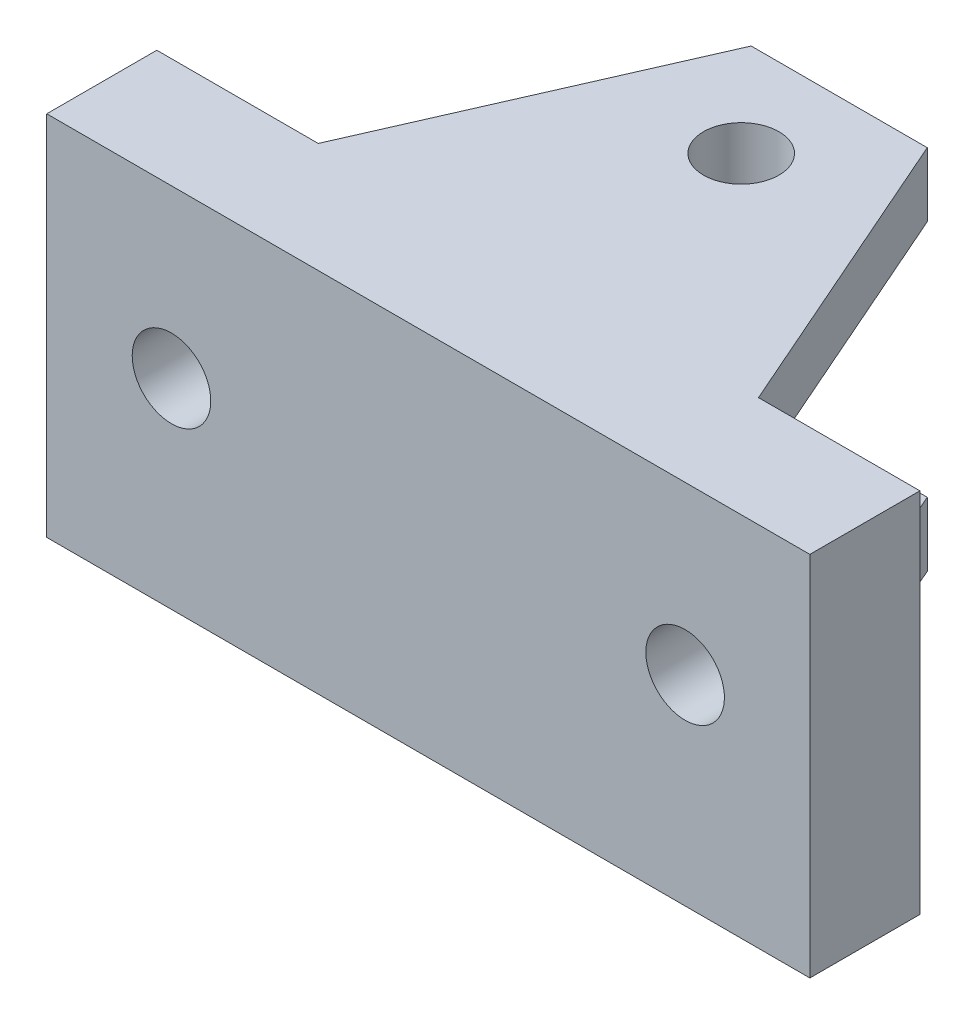
ISO-10303-21;
HEADER;
FILE_DESCRIPTION(('STEP AP214'),'2;1');
FILE_NAME('part.step','',(''),(''),'','','');
FILE_SCHEMA(('AUTOMOTIVE_DESIGN { 1 0 10303 214 1 1 1 1 }'));
ENDSEC;
DATA;
#1=APPLICATION_CONTEXT('core data for automotive mechanical design processes');
#2=APPLICATION_PROTOCOL_DEFINITION('international standard','automotive_design',2000,#1);
#3=PRODUCT_CONTEXT('',#1,'mechanical');
#4=PRODUCT('Part','Part','',(#3));
#5=PRODUCT_RELATED_PRODUCT_CATEGORY('part','',(#4));
#6=PRODUCT_DEFINITION_FORMATION('','',#4);
#7=PRODUCT_DEFINITION_CONTEXT('part definition',#1,'design');
#8=PRODUCT_DEFINITION('design','',#6,#7);
#9=PRODUCT_DEFINITION_SHAPE('','',#8);
#10=(LENGTH_UNIT() NAMED_UNIT(*) SI_UNIT(.MILLI.,.METRE.));
#11=(NAMED_UNIT(*) PLANE_ANGLE_UNIT() SI_UNIT($,.RADIAN.));
#12=(NAMED_UNIT(*) SI_UNIT($,.STERADIAN.) SOLID_ANGLE_UNIT());
#13=UNCERTAINTY_MEASURE_WITH_UNIT(LENGTH_MEASURE(1.E-05),#10,'distance_accuracy_value','');
#14=(GEOMETRIC_REPRESENTATION_CONTEXT(3) GLOBAL_UNCERTAINTY_ASSIGNED_CONTEXT((#13)) GLOBAL_UNIT_ASSIGNED_CONTEXT((#10,
#11,#12)) REPRESENTATION_CONTEXT('',''));
#15=CARTESIAN_POINT('',(0.,0.,0.));
#16=DIRECTION('',(0.,0.,1.));
#17=DIRECTION('',(1.,0.,0.));
#18=AXIS2_PLACEMENT_3D('',#15,#16,#17);
#19=CARTESIAN_POINT('',(76.2,8.7126108541866,-39.7797136586685));
#20=DIRECTION('',(0.,1.,0.));
#21=DIRECTION('',(0.,0.,1.));
#22=AXIS2_PLACEMENT_3D('',#19,#20,#21);
#23=PLANE('',#22);
#24=DIRECTION('',(-1.,0.,0.));
#25=VECTOR('',#24,1.);
#26=CARTESIAN_POINT('',(76.2,8.71261085418657,0.));
#27=LINE('',#26,#25);
#28=CARTESIAN_POINT('',(71.12,8.71261085418657,0.));
#29=VERTEX_POINT('',#28);
#30=CARTESIAN_POINT('',(5.08000000000003,8.71261085418657,0.));
#31=VERTEX_POINT('',#30);
#32=EDGE_CURVE('E244',#29,#31,#27,.T.);
#33=ORIENTED_EDGE('',*,*,#32,.T.);
#34=DIRECTION('',(0.,0.,-1.));
#35=VECTOR('',#34,1.);
#36=CARTESIAN_POINT('',(5.08,8.71261085418656,32.1538318089773));
#37=LINE('',#36,#35);
#38=CARTESIAN_POINT('',(5.08,8.71261085418658,-9.52499999999999));
#39=VERTEX_POINT('',#38);
#40=EDGE_CURVE('E70',#31,#39,#37,.T.);
#41=ORIENTED_EDGE('',*,*,#40,.T.);
#42=DIRECTION('',(-1.,0.,0.));
#43=VECTOR('',#42,1.);
#44=CARTESIAN_POINT('',(0.,8.71261085418656,-9.52499999999998));
#45=LINE('',#44,#43);
#46=CARTESIAN_POINT('',(19.05,8.71261085418656,-9.52499999999998));
#47=VERTEX_POINT('',#46);
#48=EDGE_CURVE('E153',#47,#39,#45,.T.);
#49=ORIENTED_EDGE('',*,*,#48,.F.);
#50=DIRECTION('',(-0.401990062035198,0.,0.915644030191284));
#51=VECTOR('',#50,1.);
#52=CARTESIAN_POINT('',(30.48,8.71261085418659,-35.5599999999999));
#53=LINE('',#52,#51);
#54=CARTESIAN_POINT('',(30.48,8.71261085418659,-35.56));
#55=VERTEX_POINT('',#54);
#56=EDGE_CURVE('E185',#55,#47,#53,.T.);
#57=ORIENTED_EDGE('',*,*,#56,.F.);
#58=DIRECTION('',(-1.,0.,0.));
#59=VECTOR('',#58,1.);
#60=CARTESIAN_POINT('',(30.48,8.71261085418659,-35.56));
#61=LINE('',#60,#59);
#62=CARTESIAN_POINT('',(45.72,8.71261085418659,-35.56));
#63=VERTEX_POINT('',#62);
#64=EDGE_CURVE('E182',#63,#55,#61,.T.);
#65=ORIENTED_EDGE('',*,*,#64,.F.);
#66=DIRECTION('',(-0.401990062035198,0.,-0.915644030191284));
#67=VECTOR('',#66,1.);
#68=CARTESIAN_POINT('',(45.72,8.71261085418659,-35.5599999999999));
#69=LINE('',#68,#67);
#70=CARTESIAN_POINT('',(57.15,8.71261085418658,-9.52499999999998));
#71=VERTEX_POINT('',#70);
#72=EDGE_CURVE('E186',#71,#63,#69,.T.);
#73=ORIENTED_EDGE('',*,*,#72,.F.);
#74=DIRECTION('',(-1.,0.,0.));
#75=VECTOR('',#74,1.);
#76=CARTESIAN_POINT('',(76.2,8.71261085418656,-9.52499999999998));
#77=LINE('',#76,#75);
#78=CARTESIAN_POINT('',(71.12,8.71261085418657,-9.52499999999999));
#79=VERTEX_POINT('',#78);
#80=EDGE_CURVE('E191',#79,#71,#77,.T.);
#81=ORIENTED_EDGE('',*,*,#80,.F.);
#82=DIRECTION('',(0.,0.,-1.));
#83=VECTOR('',#82,1.);
#84=CARTESIAN_POINT('',(71.12,8.71261085418656,32.1538318089773));
#85=LINE('',#84,#83);
#86=EDGE_CURVE('E287',#29,#79,#85,.T.);
#87=ORIENTED_EDGE('',*,*,#86,.F.);
#88=EDGE_LOOP('',(#33,#41,#49,#57,#65,#73,#81,#87));
#89=FACE_BOUND('',#88,.T.);
#90=CARTESIAN_POINT('',(38.1,8.71261085418658,-27.0797136586685));
#91=DIRECTION('',(0.,1.,0.));
#92=DIRECTION('',(0.,0.,1.));
#93=AXIS2_PLACEMENT_3D('',#90,#91,#92);
#94=CIRCLE('',#93,3.2639);
#95=CARTESIAN_POINT('',(38.1,8.71261085418656,-23.8158136586685));
#96=VERTEX_POINT('',#95);
#97=EDGE_CURVE('E198',#96,#96,#94,.F.);
#98=ORIENTED_EDGE('',*,*,#97,.F.);
#99=EDGE_LOOP('',(#98));
#100=FACE_BOUND('',#99,.T.);
#101=ADVANCED_FACE('F47',(#89,#100),#23,.F.);
#102=CARTESIAN_POINT('',(76.2,14.2625108541866,-9.52499999999999));
#103=DIRECTION('',(0.,-1.,0.));
#104=DIRECTION('',(0.,0.,-1.));
#105=AXIS2_PLACEMENT_3D('',#102,#103,#104);
#106=PLANE('',#105);
#107=CARTESIAN_POINT('',(38.1,14.2625108541866,-27.0797136586685));
#108=DIRECTION('',(0.,-1.,0.));
#109=DIRECTION('',(0.,0.,-1.));
#110=AXIS2_PLACEMENT_3D('',#107,#108,#109);
#111=CIRCLE('',#110,3.2639);
#112=CARTESIAN_POINT('',(38.1,14.2625108541866,-23.8158136586685));
#113=VERTEX_POINT('',#112);
#114=EDGE_CURVE('E222',#113,#113,#111,.T.);
#115=ORIENTED_EDGE('',*,*,#114,.T.);
#116=EDGE_LOOP('',(#115));
#117=FACE_BOUND('',#116,.T.);
#118=DIRECTION('',(-1.,0.,0.));
#119=VECTOR('',#118,1.);
#120=CARTESIAN_POINT('',(76.2,14.2625108541866,-35.56));
#121=LINE('',#120,#119);
#122=CARTESIAN_POINT('',(45.72,14.2625108541866,-35.56));
#123=VERTEX_POINT('',#122);
#124=CARTESIAN_POINT('',(30.48,14.2625108541866,-35.56));
#125=VERTEX_POINT('',#124);
#126=EDGE_CURVE('E230',#123,#125,#121,.T.);
#127=ORIENTED_EDGE('',*,*,#126,.T.);
#128=DIRECTION('',(-0.401990062035198,0.,0.915644030191284));
#129=VECTOR('',#128,1.);
#130=CARTESIAN_POINT('',(28.2852119700748,14.2625108541866,-30.5607605985037));
#131=LINE('',#130,#129);
#132=CARTESIAN_POINT('',(19.05,14.2625108541866,-9.52499999999998));
#133=VERTEX_POINT('',#132);
#134=EDGE_CURVE('E214',#125,#133,#131,.T.);
#135=ORIENTED_EDGE('',*,*,#134,.T.);
#136=DIRECTION('',(-1.,0.,0.));
#137=VECTOR('',#136,1.);
#138=CARTESIAN_POINT('',(76.2,14.2625108541866,-9.52499999999999));
#139=LINE('',#138,#137);
#140=CARTESIAN_POINT('',(57.15,14.2625108541866,-9.52499999999998));
#141=VERTEX_POINT('',#140);
#142=EDGE_CURVE('E11',#141,#133,#139,.T.);
#143=ORIENTED_EDGE('',*,*,#142,.F.);
#144=DIRECTION('',(-0.401990062035198,0.,-0.915644030191284));
#145=VECTOR('',#144,1.);
#146=CARTESIAN_POINT('',(60.2284039900249,14.2625108541866,-2.51307980049874));
#147=LINE('',#146,#145);
#148=EDGE_CURVE('E206',#141,#123,#147,.T.);
#149=ORIENTED_EDGE('',*,*,#148,.T.);
#150=EDGE_LOOP('',(#127,#135,#143,#149));
#151=FACE_BOUND('',#150,.T.);
#152=ADVANCED_FACE('F325',(#117,#151),#106,.F.);
#153=CARTESIAN_POINT('',(76.2,34.9127108541866,-9.52499999999998));
#154=DIRECTION('',(0.,0.,1.));
#155=DIRECTION('',(0.,-1.,0.));
#156=AXIS2_PLACEMENT_3D('',#153,#154,#155);
#157=PLANE('',#156);
#158=CARTESIAN_POINT('',(15.875,26.0298511799619,-9.525));
#159=DIRECTION('',(0.,0.,-1.));
#160=DIRECTION('',(-1.,0.,0.));
#161=AXIS2_PLACEMENT_3D('',#158,#159,#160);
#162=CIRCLE('',#161,3.4);
#163=CARTESIAN_POINT('',(12.475,26.0298511799619,-9.525));
#164=VERTEX_POINT('',#163);
#165=EDGE_CURVE('E240',#164,#164,#162,.T.);
#166=ORIENTED_EDGE('',*,*,#165,.F.);
#167=EDGE_LOOP('',(#166));
#168=FACE_BOUND('',#167,.T.);
#169=CARTESIAN_POINT('',(60.325,26.0298511799619,-9.525));
#170=DIRECTION('',(0.,0.,-1.));
#171=DIRECTION('',(-1.,0.,0.));
#172=AXIS2_PLACEMENT_3D('',#169,#170,#171);
#173=CIRCLE('',#172,3.4);
#174=CARTESIAN_POINT('',(56.925,26.0298511799619,-9.525));
#175=VERTEX_POINT('',#174);
#176=EDGE_CURVE('E235',#175,#175,#173,.T.);
#177=ORIENTED_EDGE('',*,*,#176,.F.);
#178=EDGE_LOOP('',(#177));
#179=FACE_BOUND('',#178,.T.);
#180=ORIENTED_EDGE('',*,*,#48,.T.);
#181=DIRECTION('',(0.,-1.,0.));
#182=VECTOR('',#181,1.);
#183=CARTESIAN_POINT('',(5.08,8.71261085418658,-9.52499999999999));
#184=LINE('',#183,#182);
#185=CARTESIAN_POINT('',(5.08,40.4626108541866,-9.52499999999998));
#186=VERTEX_POINT('',#185);
#187=EDGE_CURVE('E137',#186,#39,#184,.T.);
#188=ORIENTED_EDGE('',*,*,#187,.F.);
#189=DIRECTION('',(1.,0.,0.));
#190=VECTOR('',#189,1.);
#191=CARTESIAN_POINT('',(0.,40.4626108541866,-9.52499999999998));
#192=LINE('',#191,#190);
#193=CARTESIAN_POINT('',(19.05,40.4626108541866,-9.52499999999998));
#194=VERTEX_POINT('',#193);
#195=EDGE_CURVE('E149',#186,#194,#192,.T.);
#196=ORIENTED_EDGE('',*,*,#195,.T.);
#197=DIRECTION('',(0.,1.,0.));
#198=VECTOR('',#197,1.);
#199=CARTESIAN_POINT('',(19.05,-73.2738983931769,-9.52499999999998));
#200=LINE('',#199,#198);
#201=CARTESIAN_POINT('',(19.05,34.9127108541866,-9.52499999999998));
#202=VERTEX_POINT('',#201);
#203=EDGE_CURVE('E262',#202,#194,#200,.T.);
#204=ORIENTED_EDGE('',*,*,#203,.F.);
#205=DIRECTION('',(-1.,0.,0.));
#206=VECTOR('',#205,1.);
#207=CARTESIAN_POINT('',(76.2,34.9127108541866,-9.52499999999998));
#208=LINE('',#207,#206);
#209=CARTESIAN_POINT('',(57.15,34.9127108541866,-9.52499999999998));
#210=VERTEX_POINT('',#209);
#211=EDGE_CURVE('E55',#210,#202,#208,.T.);
#212=ORIENTED_EDGE('',*,*,#211,.F.);
#213=DIRECTION('',(0.,1.,0.));
#214=VECTOR('',#213,1.);
#215=CARTESIAN_POINT('',(57.15,-73.2738983931769,-9.52499999999998));
#216=LINE('',#215,#214);
#217=CARTESIAN_POINT('',(57.15,40.4626108541866,-9.52499999999998));
#218=VERTEX_POINT('',#217);
#219=EDGE_CURVE('E261',#210,#218,#216,.T.);
#220=ORIENTED_EDGE('',*,*,#219,.T.);
#221=DIRECTION('',(1.,0.,0.));
#222=VECTOR('',#221,1.);
#223=CARTESIAN_POINT('',(76.2,40.4626108541866,-9.52499999999998));
#224=LINE('',#223,#222);
#225=CARTESIAN_POINT('',(71.12,40.4626108541866,-9.52499999999998));
#226=VERTEX_POINT('',#225);
#227=EDGE_CURVE('E163',#218,#226,#224,.T.);
#228=ORIENTED_EDGE('',*,*,#227,.T.);
#229=DIRECTION('',(0.,1.,0.));
#230=VECTOR('',#229,1.);
#231=CARTESIAN_POINT('',(71.12,8.71261085418657,-9.52499999999999));
#232=LINE('',#231,#230);
#233=EDGE_CURVE('E155',#79,#226,#232,.T.);
#234=ORIENTED_EDGE('',*,*,#233,.F.);
#235=ORIENTED_EDGE('',*,*,#80,.T.);
#236=EDGE_CURVE('E272',#71,#141,#216,.T.);
#237=ORIENTED_EDGE('',*,*,#236,.T.);
#238=ORIENTED_EDGE('',*,*,#142,.T.);
#239=EDGE_CURVE('E265',#47,#133,#200,.T.);
#240=ORIENTED_EDGE('',*,*,#239,.F.);
#241=EDGE_LOOP('',(#180,#188,#196,#204,#212,#220,#228,#234,#235,#237,#238,#240));
#242=FACE_BOUND('',#241,.T.);
#243=ADVANCED_FACE('F147',(#168,#179,#242),#157,.F.);
#244=CARTESIAN_POINT('',(76.2,34.9127108541866,-39.7797136586685));
#245=DIRECTION('',(0.,1.,0.));
#246=DIRECTION('',(0.,0.,1.));
#247=AXIS2_PLACEMENT_3D('',#244,#245,#246);
#248=PLANE('',#247);
#249=CARTESIAN_POINT('',(38.1,34.9127108541866,-27.0797136586685));
#250=DIRECTION('',(0.,1.,0.));
#251=DIRECTION('',(0.,0.,1.));
#252=AXIS2_PLACEMENT_3D('',#249,#250,#251);
#253=CIRCLE('',#252,3.2639);
#254=CARTESIAN_POINT('',(38.1,34.9127108541866,-23.8158136586685));
#255=VERTEX_POINT('',#254);
#256=EDGE_CURVE('E218',#255,#255,#253,.T.);
#257=ORIENTED_EDGE('',*,*,#256,.T.);
#258=EDGE_LOOP('',(#257));
#259=FACE_BOUND('',#258,.T.);
#260=ORIENTED_EDGE('',*,*,#211,.T.);
#261=DIRECTION('',(0.401990062035198,0.,-0.915644030191284));
#262=VECTOR('',#261,1.);
#263=CARTESIAN_POINT('',(39.4213609377044,34.9127108541866,-55.9264332469934));
#264=LINE('',#263,#262);
#265=CARTESIAN_POINT('',(30.48,34.9127108541866,-35.56));
#266=VERTEX_POINT('',#265);
#267=EDGE_CURVE('E210',#202,#266,#264,.T.);
#268=ORIENTED_EDGE('',*,*,#267,.T.);
#269=DIRECTION('',(1.,0.,0.));
#270=VECTOR('',#269,1.);
#271=CARTESIAN_POINT('',(76.2,34.9127108541866,-35.56));
#272=LINE('',#271,#270);
#273=CARTESIAN_POINT('',(45.72,34.9127108541866,-35.56));
#274=VERTEX_POINT('',#273);
#275=EDGE_CURVE('E226',#266,#274,#272,.T.);
#276=ORIENTED_EDGE('',*,*,#275,.T.);
#277=DIRECTION('',(0.401990062035198,0.,0.915644030191284));
#278=VECTOR('',#277,1.);
#279=CARTESIAN_POINT('',(49.0922550223953,34.9127108541866,-27.8787524489884));
#280=LINE('',#279,#278);
#281=EDGE_CURVE('E202',#274,#210,#280,.T.);
#282=ORIENTED_EDGE('',*,*,#281,.T.);
#283=EDGE_LOOP('',(#260,#268,#276,#282));
#284=FACE_BOUND('',#283,.T.);
#285=ADVANCED_FACE('F260',(#259,#284),#248,.F.);
#286=CARTESIAN_POINT('',(76.2,40.4626108541866,0.));
#287=DIRECTION('',(0.,-1.,0.));
#288=DIRECTION('',(0.,0.,-1.));
#289=AXIS2_PLACEMENT_3D('',#286,#287,#288);
#290=PLANE('',#289);
#291=CARTESIAN_POINT('',(38.1,40.4626108541866,-27.0797136586685));
#292=DIRECTION('',(0.,1.,0.));
#293=DIRECTION('',(0.,0.,1.));
#294=AXIS2_PLACEMENT_3D('',#291,#292,#293);
#295=CIRCLE('',#294,3.2639);
#296=CARTESIAN_POINT('',(38.1,40.4626108541866,-23.8158136586685));
#297=VERTEX_POINT('',#296);
#298=EDGE_CURVE('E181',#297,#297,#295,.T.);
#299=ORIENTED_EDGE('',*,*,#298,.F.);
#300=EDGE_LOOP('',(#299));
#301=FACE_BOUND('',#300,.T.);
#302=ORIENTED_EDGE('',*,*,#195,.F.);
#303=DIRECTION('',(0.,0.,-1.));
#304=VECTOR('',#303,1.);
#305=CARTESIAN_POINT('',(5.08,40.4626108541866,32.1538318089773));
#306=LINE('',#305,#304);
#307=CARTESIAN_POINT('',(5.08,40.4626108541866,0.));
#308=VERTEX_POINT('',#307);
#309=EDGE_CURVE('E134',#308,#186,#306,.T.);
#310=ORIENTED_EDGE('',*,*,#309,.F.);
#311=DIRECTION('',(-1.,0.,0.));
#312=VECTOR('',#311,1.);
#313=CARTESIAN_POINT('',(76.2,40.4626108541866,0.));
#314=LINE('',#313,#312);
#315=CARTESIAN_POINT('',(71.12,40.4626108541866,0.));
#316=VERTEX_POINT('',#315);
#317=EDGE_CURVE('E254',#316,#308,#314,.T.);
#318=ORIENTED_EDGE('',*,*,#317,.F.);
#319=DIRECTION('',(0.,0.,-1.));
#320=VECTOR('',#319,1.);
#321=CARTESIAN_POINT('',(71.12,40.4626108541866,32.1538318089773));
#322=LINE('',#321,#320);
#323=EDGE_CURVE('E62',#316,#226,#322,.T.);
#324=ORIENTED_EDGE('',*,*,#323,.T.);
#325=ORIENTED_EDGE('',*,*,#227,.F.);
#326=DIRECTION('',(0.401990062035198,0.,0.915644030191284));
#327=VECTOR('',#326,1.);
#328=CARTESIAN_POINT('',(45.72,40.4626108541866,-35.56));
#329=LINE('',#328,#327);
#330=CARTESIAN_POINT('',(45.72,40.4626108541866,-35.56));
#331=VERTEX_POINT('',#330);
#332=EDGE_CURVE('E168',#331,#218,#329,.T.);
#333=ORIENTED_EDGE('',*,*,#332,.F.);
#334=DIRECTION('',(1.,0.,0.));
#335=VECTOR('',#334,1.);
#336=CARTESIAN_POINT('',(30.48,40.4626108541866,-35.56));
#337=LINE('',#336,#335);
#338=CARTESIAN_POINT('',(30.48,40.4626108541866,-35.56));
#339=VERTEX_POINT('',#338);
#340=EDGE_CURVE('E177',#339,#331,#337,.T.);
#341=ORIENTED_EDGE('',*,*,#340,.F.);
#342=DIRECTION('',(0.401990062035198,0.,-0.915644030191284));
#343=VECTOR('',#342,1.);
#344=CARTESIAN_POINT('',(30.48,40.4626108541866,-35.56));
#345=LINE('',#344,#343);
#346=EDGE_CURVE('E161',#194,#339,#345,.T.);
#347=ORIENTED_EDGE('',*,*,#346,.F.);
#348=EDGE_LOOP('',(#302,#310,#318,#324,#325,#333,#341,#347));
#349=FACE_BOUND('',#348,.T.);
#350=ADVANCED_FACE('F158',(#301,#349),#290,.F.);
#351=CARTESIAN_POINT('',(76.2,8.71261085418657,0.));
#352=DIRECTION('',(0.,0.,-1.));
#353=DIRECTION('',(0.,1.,0.));
#354=AXIS2_PLACEMENT_3D('',#351,#352,#353);
#355=PLANE('',#354);
#356=CARTESIAN_POINT('',(60.325,26.0298511799619,0.));
#357=DIRECTION('',(0.,0.,-1.));
#358=DIRECTION('',(0.,1.,0.));
#359=AXIS2_PLACEMENT_3D('',#356,#357,#358);
#360=CIRCLE('',#359,3.4);
#361=CARTESIAN_POINT('',(60.325,29.4298511799619,0.));
#362=VERTEX_POINT('',#361);
#363=EDGE_CURVE('E239',#362,#362,#360,.F.);
#364=ORIENTED_EDGE('',*,*,#363,.F.);
#365=EDGE_LOOP('',(#364));
#366=FACE_BOUND('',#365,.T.);
#367=CARTESIAN_POINT('',(15.875,26.0298511799619,0.));
#368=DIRECTION('',(0.,0.,-1.));
#369=DIRECTION('',(0.,1.,0.));
#370=AXIS2_PLACEMENT_3D('',#367,#368,#369);
#371=CIRCLE('',#370,3.4);
#372=CARTESIAN_POINT('',(15.875,29.4298511799619,0.));
#373=VERTEX_POINT('',#372);
#374=EDGE_CURVE('E234',#373,#373,#371,.F.);
#375=ORIENTED_EDGE('',*,*,#374,.F.);
#376=EDGE_LOOP('',(#375));
#377=FACE_BOUND('',#376,.T.);
#378=ORIENTED_EDGE('',*,*,#317,.T.);
#379=DIRECTION('',(0.,1.,0.));
#380=VECTOR('',#379,1.);
#381=CARTESIAN_POINT('',(5.08,8.71261085418658,0.));
#382=LINE('',#381,#380);
#383=EDGE_CURVE('E138',#31,#308,#382,.T.);
#384=ORIENTED_EDGE('',*,*,#383,.F.);
#385=ORIENTED_EDGE('',*,*,#32,.F.);
#386=DIRECTION('',(0.,-1.,0.));
#387=VECTOR('',#386,1.);
#388=CARTESIAN_POINT('',(71.12,8.71261085418657,0.));
#389=LINE('',#388,#387);
#390=EDGE_CURVE('E282',#316,#29,#389,.T.);
#391=ORIENTED_EDGE('',*,*,#390,.F.);
#392=EDGE_LOOP('',(#378,#384,#385,#391));
#393=FACE_BOUND('',#392,.T.);
#394=ADVANCED_FACE('F357',(#366,#377,#393),#355,.F.);
#395=CARTESIAN_POINT('',(15.875,26.0298511799619,9.61665222413706));
#396=DIRECTION('',(0.,0.,-1.));
#397=DIRECTION('',(-1.,0.,0.));
#398=AXIS2_PLACEMENT_3D('',#395,#396,#397);
#399=CYLINDRICAL_SURFACE('',#398,3.4);
#400=ORIENTED_EDGE('',*,*,#374,.T.);
#401=EDGE_LOOP('',(#400));
#402=FACE_BOUND('',#401,.T.);
#403=ORIENTED_EDGE('',*,*,#165,.T.);
#404=EDGE_LOOP('',(#403));
#405=FACE_BOUND('',#404,.T.);
#406=ADVANCED_FACE('F317',(#402,#405),#399,.F.);
#407=CARTESIAN_POINT('',(60.325,26.0298511799619,9.61665222413706));
#408=DIRECTION('',(0.,0.,-1.));
#409=DIRECTION('',(-1.,0.,0.));
#410=AXIS2_PLACEMENT_3D('',#407,#408,#409);
#411=CYLINDRICAL_SURFACE('',#410,3.4);
#412=ORIENTED_EDGE('',*,*,#363,.T.);
#413=EDGE_LOOP('',(#412));
#414=FACE_BOUND('',#413,.T.);
#415=ORIENTED_EDGE('',*,*,#176,.T.);
#416=EDGE_LOOP('',(#415));
#417=FACE_BOUND('',#416,.T.);
#418=ADVANCED_FACE('F308',(#414,#417),#411,.F.);
#419=CARTESIAN_POINT('',(45.72,-73.2738983931769,-35.56));
#420=DIRECTION('',(-0.915644030191284,0.,0.401990062035198));
#421=DIRECTION('',(0.401990062035198,0.,0.915644030191284));
#422=AXIS2_PLACEMENT_3D('',#419,#420,#421);
#423=PLANE('',#422);
#424=DIRECTION('',(0.,1.,0.));
#425=VECTOR('',#424,1.);
#426=CARTESIAN_POINT('',(45.72,-73.2738983931769,-35.56));
#427=LINE('',#426,#425);
#428=EDGE_CURVE('E276',#274,#331,#427,.T.);
#429=ORIENTED_EDGE('',*,*,#428,.T.);
#430=ORIENTED_EDGE('',*,*,#332,.T.);
#431=ORIENTED_EDGE('',*,*,#219,.F.);
#432=ORIENTED_EDGE('',*,*,#281,.F.);
#433=EDGE_LOOP('',(#429,#430,#431,#432));
#434=FACE_BOUND('',#433,.T.);
#435=ADVANCED_FACE('F304',(#434),#423,.F.);
#436=CARTESIAN_POINT('',(30.48,-73.2738983931769,-35.56));
#437=DIRECTION('',(0.915644030191284,0.,0.401990062035198));
#438=DIRECTION('',(0.401990062035198,0.,-0.915644030191284));
#439=AXIS2_PLACEMENT_3D('',#436,#437,#438);
#440=PLANE('',#439);
#441=ORIENTED_EDGE('',*,*,#203,.T.);
#442=ORIENTED_EDGE('',*,*,#346,.T.);
#443=DIRECTION('',(0.,1.,0.));
#444=VECTOR('',#443,1.);
#445=CARTESIAN_POINT('',(30.48,-73.2738983931769,-35.56));
#446=LINE('',#445,#444);
#447=EDGE_CURVE('E194',#266,#339,#446,.T.);
#448=ORIENTED_EDGE('',*,*,#447,.F.);
#449=ORIENTED_EDGE('',*,*,#267,.F.);
#450=EDGE_LOOP('',(#441,#442,#448,#449));
#451=FACE_BOUND('',#450,.T.);
#452=ADVANCED_FACE('F301',(#451),#440,.F.);
#453=CARTESIAN_POINT('',(30.48,-73.2738983931769,-35.56));
#454=DIRECTION('',(0.,0.,1.));
#455=DIRECTION('',(1.,0.,0.));
#456=AXIS2_PLACEMENT_3D('',#453,#454,#455);
#457=PLANE('',#456);
#458=ORIENTED_EDGE('',*,*,#447,.T.);
#459=ORIENTED_EDGE('',*,*,#340,.T.);
#460=ORIENTED_EDGE('',*,*,#428,.F.);
#461=ORIENTED_EDGE('',*,*,#275,.F.);
#462=EDGE_LOOP('',(#458,#459,#460,#461));
#463=FACE_BOUND('',#462,.T.);
#464=ADVANCED_FACE('F298',(#463),#457,.F.);
#465=EDGE_CURVE('E170',#63,#123,#427,.T.);
#466=ORIENTED_EDGE('',*,*,#465,.F.);
#467=ORIENTED_EDGE('',*,*,#64,.T.);
#468=EDGE_CURVE('E266',#55,#125,#446,.T.);
#469=ORIENTED_EDGE('',*,*,#468,.T.);
#470=ORIENTED_EDGE('',*,*,#126,.F.);
#471=EDGE_LOOP('',(#466,#467,#469,#470));
#472=FACE_BOUND('',#471,.T.);
#473=ADVANCED_FACE('F347',(#472),#457,.F.);
#474=ORIENTED_EDGE('',*,*,#468,.F.);
#475=ORIENTED_EDGE('',*,*,#56,.T.);
#476=ORIENTED_EDGE('',*,*,#239,.T.);
#477=ORIENTED_EDGE('',*,*,#134,.F.);
#478=EDGE_LOOP('',(#474,#475,#476,#477));
#479=FACE_BOUND('',#478,.T.);
#480=ADVANCED_FACE('F316',(#479),#440,.F.);
#481=ORIENTED_EDGE('',*,*,#236,.F.);
#482=ORIENTED_EDGE('',*,*,#72,.T.);
#483=ORIENTED_EDGE('',*,*,#465,.T.);
#484=ORIENTED_EDGE('',*,*,#148,.F.);
#485=EDGE_LOOP('',(#481,#482,#483,#484));
#486=FACE_BOUND('',#485,.T.);
#487=ADVANCED_FACE('F310',(#486),#423,.F.);
#488=CARTESIAN_POINT('',(38.1,-73.2738983931769,-27.0797136586685));
#489=DIRECTION('',(0.,1.,0.));
#490=DIRECTION('',(0.,0.,1.));
#491=AXIS2_PLACEMENT_3D('',#488,#489,#490);
#492=CYLINDRICAL_SURFACE('',#491,3.2639);
#493=ORIENTED_EDGE('',*,*,#298,.T.);
#494=EDGE_LOOP('',(#493));
#495=FACE_BOUND('',#494,.T.);
#496=ORIENTED_EDGE('',*,*,#256,.F.);
#497=EDGE_LOOP('',(#496));
#498=FACE_BOUND('',#497,.T.);
#499=ADVANCED_FACE('F322',(#495,#498),#492,.F.);
#500=CARTESIAN_POINT('',(38.1,8.71261085418656,-23.8158136586685));
#501=CARTESIAN_POINT('',(38.1,8.7704223125199,-23.8158136586685));
#502=CARTESIAN_POINT('',(38.1,8.82823377085323,-23.8158136586685));
#503=CARTESIAN_POINT('',(38.1,8.9438566875199,-23.8158136586685));
#504=CARTESIAN_POINT('',(38.1,9.00166814585324,-23.8158136586685));
#505=CARTESIAN_POINT('',(38.1,9.1172910625199,-23.8158136586685));
#506=CARTESIAN_POINT('',(38.1,9.17510252085323,-23.8158136586685));
#507=CARTESIAN_POINT('',(38.1,9.29072543751989,-23.8158136586685));
#508=CARTESIAN_POINT('',(38.1,9.34853689585323,-23.8158136586685));
#509=CARTESIAN_POINT('',(38.1,9.4641598125199,-23.8158136586685));
#510=CARTESIAN_POINT('',(38.1,9.52197127085323,-23.8158136586685));
#511=CARTESIAN_POINT('',(38.1,9.6375941875199,-23.8158136586685));
#512=CARTESIAN_POINT('',(38.1,9.69540564585324,-23.8158136586685));
#513=CARTESIAN_POINT('',(38.1,9.8110285625199,-23.8158136586685));
#514=CARTESIAN_POINT('',(38.1,9.86884002085324,-23.8158136586685));
#515=CARTESIAN_POINT('',(38.1,9.9844629375199,-23.8158136586685));
#516=CARTESIAN_POINT('',(38.1,10.0422743958532,-23.8158136586685));
#517=CARTESIAN_POINT('',(38.1,10.1578973125199,-23.8158136586685));
#518=CARTESIAN_POINT('',(38.1,10.2157087708532,-23.8158136586685));
#519=CARTESIAN_POINT('',(38.1,10.3313316875199,-23.8158136586685));
#520=CARTESIAN_POINT('',(38.1,10.3891431458532,-23.8158136586685));
#521=CARTESIAN_POINT('',(38.1,10.5047660625199,-23.8158136586685));
#522=CARTESIAN_POINT('',(38.1,10.5625775208532,-23.8158136586685));
#523=CARTESIAN_POINT('',(38.1,10.6782004375199,-23.8158136586685));
#524=CARTESIAN_POINT('',(38.1,10.7360118958532,-23.8158136586685));
#525=CARTESIAN_POINT('',(38.1,10.8516348125199,-23.8158136586685));
#526=CARTESIAN_POINT('',(38.1,10.9094462708532,-23.8158136586685));
#527=CARTESIAN_POINT('',(38.1,11.0250691875199,-23.8158136586685));
#528=CARTESIAN_POINT('',(38.1,11.0828806458532,-23.8158136586685));
#529=CARTESIAN_POINT('',(38.1,11.1985035625199,-23.8158136586685));
#530=CARTESIAN_POINT('',(38.1,11.2563150208532,-23.8158136586685));
#531=CARTESIAN_POINT('',(38.1,11.3719379375199,-23.8158136586685));
#532=CARTESIAN_POINT('',(38.1,11.4297493958532,-23.8158136586685));
#533=CARTESIAN_POINT('',(38.1,11.5453723125199,-23.8158136586685));
#534=CARTESIAN_POINT('',(38.1,11.6031837708532,-23.8158136586685));
#535=CARTESIAN_POINT('',(38.1,11.7188066875199,-23.8158136586685));
#536=CARTESIAN_POINT('',(38.1,11.7766181458532,-23.8158136586685));
#537=CARTESIAN_POINT('',(38.1,11.8922410625199,-23.8158136586685));
#538=CARTESIAN_POINT('',(38.1,11.9500525208532,-23.8158136586685));
#539=CARTESIAN_POINT('',(38.1,12.0656754375199,-23.8158136586685));
#540=CARTESIAN_POINT('',(38.1,12.1234868958532,-23.8158136586685));
#541=CARTESIAN_POINT('',(38.1,12.2391098125199,-23.8158136586685));
#542=CARTESIAN_POINT('',(38.1,12.2969212708532,-23.8158136586685));
#543=CARTESIAN_POINT('',(38.1,12.4125441875199,-23.8158136586685));
#544=CARTESIAN_POINT('',(38.1,12.4703556458532,-23.8158136586685));
#545=CARTESIAN_POINT('',(38.1,12.5859785625199,-23.8158136586685));
#546=CARTESIAN_POINT('',(38.1,12.6437900208533,-23.8158136586685));
#547=CARTESIAN_POINT('',(38.1,12.7594129375199,-23.8158136586685));
#548=CARTESIAN_POINT('',(38.1,12.8172243958533,-23.8158136586685));
#549=CARTESIAN_POINT('',(38.1,12.9328473125199,-23.8158136586685));
#550=CARTESIAN_POINT('',(38.1,12.9906587708532,-23.8158136586685));
#551=CARTESIAN_POINT('',(38.1,13.1062816875199,-23.8158136586685));
#552=CARTESIAN_POINT('',(38.1,13.1640931458532,-23.8158136586685));
#553=CARTESIAN_POINT('',(38.1,13.2797160625199,-23.8158136586685));
#554=CARTESIAN_POINT('',(38.1,13.3375275208533,-23.8158136586685));
#555=CARTESIAN_POINT('',(38.1,13.4531504375199,-23.8158136586685));
#556=CARTESIAN_POINT('',(38.1,13.5109618958533,-23.8158136586685));
#557=CARTESIAN_POINT('',(38.1,13.6265848125199,-23.8158136586685));
#558=CARTESIAN_POINT('',(38.1,13.6843962708533,-23.8158136586685));
#559=CARTESIAN_POINT('',(38.1,13.8000191875199,-23.8158136586685));
#560=CARTESIAN_POINT('',(38.1,13.8578306458533,-23.8158136586685));
#561=CARTESIAN_POINT('',(38.1,13.9734535625199,-23.8158136586685));
#562=CARTESIAN_POINT('',(38.1,14.0312650208533,-23.8158136586685));
#563=CARTESIAN_POINT('',(38.1,14.1468879375199,-23.8158136586685));
#564=CARTESIAN_POINT('',(38.1,14.2046993958533,-23.8158136586685));
#565=CARTESIAN_POINT('',(38.1,14.2625108541866,-23.8158136586685));
#566=B_SPLINE_CURVE_WITH_KNOTS('',3,(#500,#501,#502,#503,#504,#505,#506,#507,#508,#509,#510,
#511,#512,#513,#514,#515,#516,#517,#518,#519,#520,#521,#522,#523,#524,#525,#526,#527,#528,#529,
#530,#531,#532,#533,#534,#535,#536,#537,#538,#539,#540,#541,#542,#543,#544,#545,#546,#547,#548,
#549,#550,#551,#552,#553,#554,#555,#556,#557,#558,#559,#560,#561,#562,#563,#564,#565),
.UNSPECIFIED.,.F.,.F.,(4,2,2,2,2,2,2,2,2,2,2,2,2,2,2,2,2,2,2,2,2,2,2,2,2,2,2,2,2,2,2,2,4),(0.,
0.173434375000003,0.346868750000007,0.520303124999996,0.6937375,0.867171875000003,
1.04060625000001,1.21404062500001,1.387475,1.560909375,1.73434375000001,1.90777812500001,
2.08121250000001,2.25464687500002,2.42808125000001,2.60151562500001,2.77495000000001,
2.94838437500002,3.12181875000002,3.29525312500001,3.46868750000001,3.64212187500002,
3.81555625000002,3.98899062500002,4.16242500000003,4.33585937500001,4.50929375000002,
4.68272812500002,4.85616250000002,5.02959687500003,5.20303125000002,5.37646562500002,
5.54990000000002),.UNSPECIFIED.);
#567=EDGE_CURVE('BSEAM338',#96,#113,#566,.T.);
#568=ORIENTED_EDGE('',*,*,#97,.T.);
#569=ORIENTED_EDGE('',*,*,#114,.F.);
#570=ORIENTED_EDGE('',*,*,#567,.T.);
#571=ORIENTED_EDGE('',*,*,#567,.F.);
#572=EDGE_LOOP('',(#568,#570,#569,#571));
#573=FACE_BOUND('',#572,.T.);
#574=ADVANCED_FACE('F338',(#573),#492,.F.);
#575=CARTESIAN_POINT('',(71.12,8.71261085418656,32.1538318089773));
#576=DIRECTION('',(-1.,0.,0.));
#577=DIRECTION('',(0.,0.,1.));
#578=AXIS2_PLACEMENT_3D('',#575,#576,#577);
#579=PLANE('',#578);
#580=ORIENTED_EDGE('',*,*,#390,.T.);
#581=ORIENTED_EDGE('',*,*,#86,.T.);
#582=ORIENTED_EDGE('',*,*,#233,.T.);
#583=ORIENTED_EDGE('',*,*,#323,.F.);
#584=EDGE_LOOP('',(#580,#581,#582,#583));
#585=FACE_BOUND('',#584,.T.);
#586=ADVANCED_FACE('F340',(#585),#579,.F.);
#587=CARTESIAN_POINT('',(5.08,8.71261085418656,32.1538318089773));
#588=DIRECTION('',(1.,0.,0.));
#589=DIRECTION('',(0.,0.,-1.));
#590=AXIS2_PLACEMENT_3D('',#587,#588,#589);
#591=PLANE('',#590);
#592=ORIENTED_EDGE('',*,*,#383,.T.);
#593=ORIENTED_EDGE('',*,*,#309,.T.);
#594=ORIENTED_EDGE('',*,*,#187,.T.);
#595=ORIENTED_EDGE('',*,*,#40,.F.);
#596=EDGE_LOOP('',(#592,#593,#594,#595));
#597=FACE_BOUND('',#596,.T.);
#598=ADVANCED_FACE('F136',(#597),#591,.F.);
#599=CLOSED_SHELL('',(#101,#152,#243,#285,#350,#394,#406,#418,#435,#452,#464,#473,#480,#487,
#499,#574,#586,#598));
#600=MANIFOLD_SOLID_BREP('B2',#599);
#601=ADVANCED_BREP_SHAPE_REPRESENTATION('',(#18,#600),#14);
#602=SHAPE_DEFINITION_REPRESENTATION(#9,#601);
ENDSEC;
END-ISO-10303-21;
